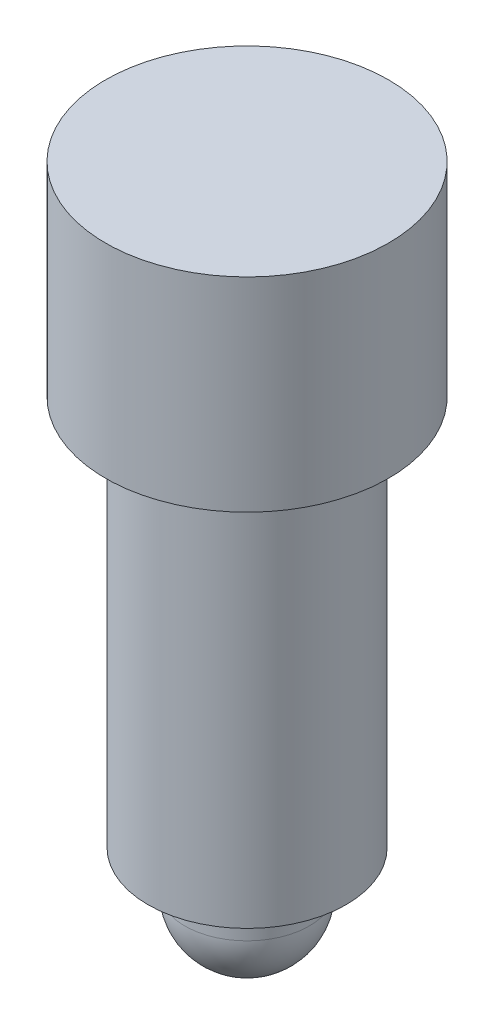
ISO-10303-21;
HEADER;
FILE_DESCRIPTION(('STEP AP214'),'2;1');
FILE_NAME('part.step','',(''),(''),'','','');
FILE_SCHEMA(('AUTOMOTIVE_DESIGN { 1 0 10303 214 1 1 1 1 }'));
ENDSEC;
DATA;
#1=APPLICATION_CONTEXT('core data for automotive mechanical design processes');
#2=APPLICATION_PROTOCOL_DEFINITION('international standard','automotive_design',2000,#1);
#3=PRODUCT_CONTEXT('',#1,'mechanical');
#4=PRODUCT('Part','Part','',(#3));
#5=PRODUCT_RELATED_PRODUCT_CATEGORY('part','',(#4));
#6=PRODUCT_DEFINITION_FORMATION('','',#4);
#7=PRODUCT_DEFINITION_CONTEXT('part definition',#1,'design');
#8=PRODUCT_DEFINITION('design','',#6,#7);
#9=PRODUCT_DEFINITION_SHAPE('','',#8);
#10=(LENGTH_UNIT() NAMED_UNIT(*) SI_UNIT(.MILLI.,.METRE.));
#11=(NAMED_UNIT(*) PLANE_ANGLE_UNIT() SI_UNIT($,.RADIAN.));
#12=(NAMED_UNIT(*) SI_UNIT($,.STERADIAN.) SOLID_ANGLE_UNIT());
#13=UNCERTAINTY_MEASURE_WITH_UNIT(LENGTH_MEASURE(1.E-05),#10,'distance_accuracy_value','');
#14=(GEOMETRIC_REPRESENTATION_CONTEXT(3) GLOBAL_UNCERTAINTY_ASSIGNED_CONTEXT((#13)) GLOBAL_UNIT_ASSIGNED_CONTEXT((#10,
#11,#12)) REPRESENTATION_CONTEXT('',''));
#15=CARTESIAN_POINT('',(0.,0.,0.));
#16=DIRECTION('',(0.,0.,1.));
#17=DIRECTION('',(1.,0.,0.));
#18=AXIS2_PLACEMENT_3D('',#15,#16,#17);
#19=CARTESIAN_POINT('',(0.,0.,0.));
#20=DIRECTION('',(0.,-1.,0.));
#21=DIRECTION('',(0.,0.,-1.));
#22=AXIS2_PLACEMENT_3D('',#19,#20,#21);
#23=CYLINDRICAL_SURFACE('',#22,5.);
#24=CARTESIAN_POINT('',(0.,24.5,0.));
#25=DIRECTION('',(0.,-1.,0.));
#26=DIRECTION('',(0.,0.,-1.));
#27=AXIS2_PLACEMENT_3D('',#24,#25,#26);
#28=CIRCLE('',#27,5.);
#29=CARTESIAN_POINT('',(0.,24.5,-5.));
#30=VERTEX_POINT('',#29);
#31=EDGE_CURVE('E12',#30,#30,#28,.T.);
#32=ORIENTED_EDGE('',*,*,#31,.T.);
#33=EDGE_LOOP('',(#32));
#34=FACE_BOUND('',#33,.T.);
#35=CARTESIAN_POINT('',(0.,17.3,0.));
#36=DIRECTION('',(0.,-1.,0.));
#37=DIRECTION('',(0.,0.,-1.));
#38=AXIS2_PLACEMENT_3D('',#35,#36,#37);
#39=CIRCLE('',#38,5.);
#40=CARTESIAN_POINT('',(0.,17.3,-5.));
#41=VERTEX_POINT('',#40);
#42=EDGE_CURVE('E38',#41,#41,#39,.T.);
#43=ORIENTED_EDGE('',*,*,#42,.F.);
#44=EDGE_LOOP('',(#43));
#45=FACE_BOUND('',#44,.T.);
#46=ADVANCED_FACE('F22',(#34,#45),#23,.T.);
#47=CARTESIAN_POINT('',(0.,0.,0.));
#48=DIRECTION('',(0.,-1.,0.));
#49=DIRECTION('',(0.,0.,-1.));
#50=AXIS2_PLACEMENT_3D('',#47,#48,#49);
#51=CYLINDRICAL_SURFACE('',#50,3.5);
#52=CARTESIAN_POINT('',(0.,17.3,0.));
#53=DIRECTION('',(0.,-1.,0.));
#54=DIRECTION('',(0.,0.,-1.));
#55=AXIS2_PLACEMENT_3D('',#52,#53,#54);
#56=CIRCLE('',#55,3.5);
#57=CARTESIAN_POINT('',(0.,17.3,-3.5));
#58=VERTEX_POINT('',#57);
#59=EDGE_CURVE('E30',#58,#58,#56,.T.);
#60=ORIENTED_EDGE('',*,*,#59,.T.);
#61=EDGE_LOOP('',(#60));
#62=FACE_BOUND('',#61,.T.);
#63=CARTESIAN_POINT('',(0.,3.5,0.));
#64=DIRECTION('',(0.,-1.,0.));
#65=DIRECTION('',(0.,0.,-1.));
#66=AXIS2_PLACEMENT_3D('',#63,#64,#65);
#67=CIRCLE('',#66,3.5);
#68=CARTESIAN_POINT('',(0.,3.5,-3.5));
#69=VERTEX_POINT('',#68);
#70=EDGE_CURVE('E40',#69,#69,#67,.T.);
#71=ORIENTED_EDGE('',*,*,#70,.F.);
#72=EDGE_LOOP('',(#71));
#73=FACE_BOUND('',#72,.T.);
#74=ADVANCED_FACE('F52',(#62,#73),#51,.T.);
#75=CARTESIAN_POINT('',(0.,0.,0.));
#76=DIRECTION('',(0.,-1.,0.));
#77=DIRECTION('',(0.,0.,-1.));
#78=AXIS2_PLACEMENT_3D('',#75,#76,#77);
#79=CYLINDRICAL_SURFACE('',#78,2.2);
#80=CARTESIAN_POINT('',(0.,3.5,0.));
#81=DIRECTION('',(0.,-1.,0.));
#82=DIRECTION('',(0.,0.,-1.));
#83=AXIS2_PLACEMENT_3D('',#80,#81,#82);
#84=CIRCLE('',#83,2.2);
#85=CARTESIAN_POINT('',(0.,3.5,-2.2));
#86=VERTEX_POINT('',#85);
#87=EDGE_CURVE('E35',#86,#86,#84,.T.);
#88=ORIENTED_EDGE('',*,*,#87,.T.);
#89=EDGE_LOOP('',(#88));
#90=FACE_BOUND('',#89,.T.);
#91=CARTESIAN_POINT('',(0.,2.2,0.));
#92=DIRECTION('',(0.,-1.,0.));
#93=DIRECTION('',(0.,0.,-1.));
#94=AXIS2_PLACEMENT_3D('',#91,#92,#93);
#95=CIRCLE('',#94,2.2);
#96=CARTESIAN_POINT('',(0.,2.2,-2.2));
#97=VERTEX_POINT('',#96);
#98=EDGE_CURVE('E26',#97,#97,#95,.T.);
#99=ORIENTED_EDGE('',*,*,#98,.F.);
#100=EDGE_LOOP('',(#99));
#101=FACE_BOUND('',#100,.T.);
#102=ADVANCED_FACE('F24',(#90,#101),#79,.T.);
#103=CARTESIAN_POINT('',(0.,2.2,0.));
#104=DIRECTION('',(0.,1.,0.));
#105=DIRECTION('',(0.,0.,-1.));
#106=AXIS2_PLACEMENT_3D('',#103,#104,#105);
#107=SPHERICAL_SURFACE('',#106,2.2);
#108=ORIENTED_EDGE('',*,*,#98,.T.);
#109=EDGE_LOOP('',(#108));
#110=FACE_BOUND('',#109,.T.);
#111=ADVANCED_FACE('F49',(#110),#107,.T.);
#112=CARTESIAN_POINT('',(2.2,3.5,0.));
#113=DIRECTION('',(0.,-1.,0.));
#114=DIRECTION('',(0.,0.,-1.));
#115=AXIS2_PLACEMENT_3D('',#112,#113,#114);
#116=PLANE('',#115);
#117=ORIENTED_EDGE('',*,*,#70,.T.);
#118=EDGE_LOOP('',(#117));
#119=FACE_BOUND('',#118,.T.);
#120=ORIENTED_EDGE('',*,*,#87,.F.);
#121=EDGE_LOOP('',(#120));
#122=FACE_BOUND('',#121,.T.);
#123=ADVANCED_FACE('F58',(#119,#122),#116,.T.);
#124=CARTESIAN_POINT('',(3.5,17.3,0.));
#125=DIRECTION('',(0.,-1.,0.));
#126=DIRECTION('',(0.,0.,-1.));
#127=AXIS2_PLACEMENT_3D('',#124,#125,#126);
#128=PLANE('',#127);
#129=ORIENTED_EDGE('',*,*,#42,.T.);
#130=EDGE_LOOP('',(#129));
#131=FACE_BOUND('',#130,.T.);
#132=ORIENTED_EDGE('',*,*,#59,.F.);
#133=EDGE_LOOP('',(#132));
#134=FACE_BOUND('',#133,.T.);
#135=ADVANCED_FACE('F70',(#131,#134),#128,.T.);
#136=CARTESIAN_POINT('',(5.,24.5,0.));
#137=DIRECTION('',(0.,1.,0.));
#138=DIRECTION('',(0.,0.,1.));
#139=AXIS2_PLACEMENT_3D('',#136,#137,#138);
#140=PLANE('',#139);
#141=ORIENTED_EDGE('',*,*,#31,.F.);
#142=EDGE_LOOP('',(#141));
#143=FACE_BOUND('',#142,.T.);
#144=ADVANCED_FACE('F67',(#143),#140,.T.);
#145=CLOSED_SHELL('',(#46,#74,#102,#111,#123,#135,#144));
#146=MANIFOLD_SOLID_BREP('B1',#145);
#147=ADVANCED_BREP_SHAPE_REPRESENTATION('',(#18,#146),#14);
#148=SHAPE_DEFINITION_REPRESENTATION(#9,#147);
ENDSEC;
END-ISO-10303-21;
